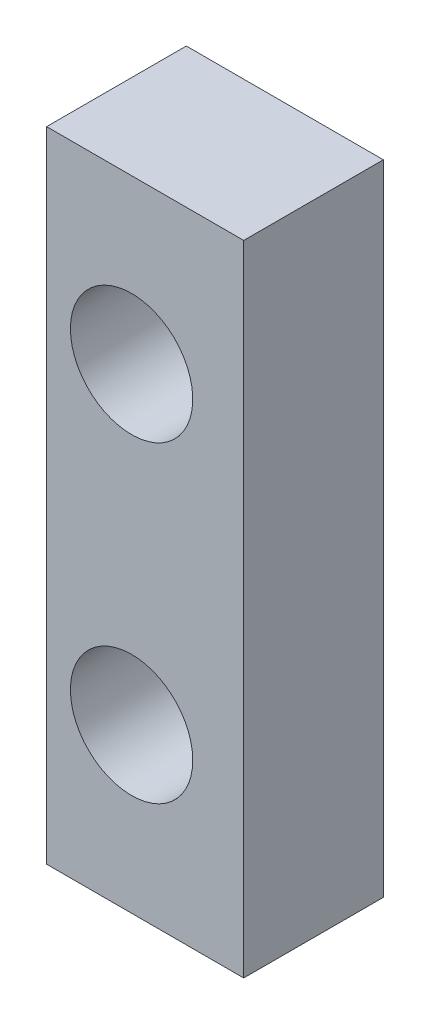
ISO-10303-21;
HEADER;
FILE_DESCRIPTION(('STEP AP214'),'2;1');
FILE_NAME('part.step','',(''),(''),'','','');
FILE_SCHEMA(('AUTOMOTIVE_DESIGN { 1 0 10303 214 1 1 1 1 }'));
ENDSEC;
DATA;
#1=APPLICATION_CONTEXT('core data for automotive mechanical design processes');
#2=APPLICATION_PROTOCOL_DEFINITION('international standard','automotive_design',2000,#1);
#3=PRODUCT_CONTEXT('',#1,'mechanical');
#4=PRODUCT('Part','Part','',(#3));
#5=PRODUCT_RELATED_PRODUCT_CATEGORY('part','',(#4));
#6=PRODUCT_DEFINITION_FORMATION('','',#4);
#7=PRODUCT_DEFINITION_CONTEXT('part definition',#1,'design');
#8=PRODUCT_DEFINITION('design','',#6,#7);
#9=PRODUCT_DEFINITION_SHAPE('','',#8);
#10=(LENGTH_UNIT() NAMED_UNIT(*) SI_UNIT(.MILLI.,.METRE.));
#11=(NAMED_UNIT(*) PLANE_ANGLE_UNIT() SI_UNIT($,.RADIAN.));
#12=(NAMED_UNIT(*) SI_UNIT($,.STERADIAN.) SOLID_ANGLE_UNIT());
#13=UNCERTAINTY_MEASURE_WITH_UNIT(LENGTH_MEASURE(1.E-05),#10,'distance_accuracy_value','');
#14=(GEOMETRIC_REPRESENTATION_CONTEXT(3) GLOBAL_UNCERTAINTY_ASSIGNED_CONTEXT((#13)) GLOBAL_UNIT_ASSIGNED_CONTEXT((#10,
#11,#12)) REPRESENTATION_CONTEXT('',''));
#15=CARTESIAN_POINT('',(0.,0.,0.));
#16=DIRECTION('',(0.,0.,1.));
#17=DIRECTION('',(1.,0.,0.));
#18=AXIS2_PLACEMENT_3D('',#15,#16,#17);
#19=CARTESIAN_POINT('',(0.,0.,2.));
#20=DIRECTION('',(0.,0.,1.));
#21=DIRECTION('',(1.,0.,0.));
#22=AXIS2_PLACEMENT_3D('',#19,#20,#21);
#23=PLANE('',#22);
#24=CARTESIAN_POINT('',(-76.4521460654272,-15.7054679044071,2.));
#25=DIRECTION('',(0.,0.,1.));
#26=DIRECTION('',(1.,0.,0.));
#27=AXIS2_PLACEMENT_3D('',#24,#25,#26);
#28=CIRCLE('',#27,0.875876913438823);
#29=CARTESIAN_POINT('',(-75.5762691519884,-15.7054679044071,2.));
#30=VERTEX_POINT('',#29);
#31=EDGE_CURVE('E108',#30,#30,#28,.T.);
#32=ORIENTED_EDGE('',*,*,#31,.F.);
#33=EDGE_LOOP('',(#32));
#34=FACE_BOUND('',#33,.T.);
#35=DIRECTION('',(1.,0.,0.));
#36=VECTOR('',#35,1.);
#37=CARTESIAN_POINT('',(-77.6686417784937,-18.0411396735773,2.));
#38=LINE('',#37,#36);
#39=CARTESIAN_POINT('',(-77.6686417784937,-18.0411396735773,2.));
#40=VERTEX_POINT('',#39);
#41=CARTESIAN_POINT('',(-74.8463717240987,-18.0411396735773,2.));
#42=VERTEX_POINT('',#41);
#43=EDGE_CURVE('E93',#40,#42,#38,.T.);
#44=ORIENTED_EDGE('',*,*,#43,.T.);
#45=DIRECTION('',(0.,1.,0.));
#46=VECTOR('',#45,1.);
#47=CARTESIAN_POINT('',(-74.8463717240987,-18.0411396735773,2.));
#48=LINE('',#47,#46);
#49=CARTESIAN_POINT('',(-74.8463717240987,-8.89309191099405,2.));
#50=VERTEX_POINT('',#49);
#51=EDGE_CURVE('E88',#42,#50,#48,.T.);
#52=ORIENTED_EDGE('',*,*,#51,.T.);
#53=DIRECTION('',(-1.,0.,0.));
#54=VECTOR('',#53,1.);
#55=CARTESIAN_POINT('',(-77.6686417784937,-8.89309191099405,2.));
#56=LINE('',#55,#54);
#57=CARTESIAN_POINT('',(-77.6686417784937,-8.89309191099405,2.));
#58=VERTEX_POINT('',#57);
#59=EDGE_CURVE('E91',#50,#58,#56,.T.);
#60=ORIENTED_EDGE('',*,*,#59,.T.);
#61=DIRECTION('',(0.,-1.,0.));
#62=VECTOR('',#61,1.);
#63=CARTESIAN_POINT('',(-77.6686417784937,-8.89309191099405,2.));
#64=LINE('',#63,#62);
#65=EDGE_CURVE('E58',#58,#40,#64,.T.);
#66=ORIENTED_EDGE('',*,*,#65,.T.);
#67=EDGE_LOOP('',(#44,#52,#60,#66));
#68=FACE_BOUND('',#67,.T.);
#69=CARTESIAN_POINT('',(-76.4521460654272,-11.2287636801643,2.));
#70=DIRECTION('',(0.,0.,1.));
#71=DIRECTION('',(-1.,0.,0.));
#72=AXIS2_PLACEMENT_3D('',#69,#70,#71);
#73=CIRCLE('',#72,0.875876913438823);
#74=CARTESIAN_POINT('',(-77.328022978866,-11.2287636801643,2.));
#75=VERTEX_POINT('',#74);
#76=EDGE_CURVE('E123',#75,#75,#73,.T.);
#77=ORIENTED_EDGE('',*,*,#76,.F.);
#78=EDGE_LOOP('',(#77));
#79=FACE_BOUND('',#78,.T.);
#80=ADVANCED_FACE('F41',(#34,#68,#79),#23,.T.);
#81=CARTESIAN_POINT('',(0.,0.,0.));
#82=DIRECTION('',(0.,0.,1.));
#83=DIRECTION('',(1.,0.,0.));
#84=AXIS2_PLACEMENT_3D('',#81,#82,#83);
#85=PLANE('',#84);
#86=DIRECTION('',(1.,0.,0.));
#87=VECTOR('',#86,1.);
#88=CARTESIAN_POINT('',(-77.6686417784937,-18.0411396735773,0.));
#89=LINE('',#88,#87);
#90=CARTESIAN_POINT('',(-77.6686417784937,-18.0411396735773,0.));
#91=VERTEX_POINT('',#90);
#92=CARTESIAN_POINT('',(-74.8463717240987,-18.0411396735773,0.));
#93=VERTEX_POINT('',#92);
#94=EDGE_CURVE('E105',#91,#93,#89,.T.);
#95=ORIENTED_EDGE('',*,*,#94,.F.);
#96=DIRECTION('',(0.,-1.,0.));
#97=VECTOR('',#96,1.);
#98=CARTESIAN_POINT('',(-77.6686417784937,-8.89309191099405,0.));
#99=LINE('',#98,#97);
#100=CARTESIAN_POINT('',(-77.6686417784937,-8.89309191099405,0.));
#101=VERTEX_POINT('',#100);
#102=EDGE_CURVE('E81',#101,#91,#99,.T.);
#103=ORIENTED_EDGE('',*,*,#102,.F.);
#104=DIRECTION('',(-1.,0.,0.));
#105=VECTOR('',#104,1.);
#106=CARTESIAN_POINT('',(-77.6686417784937,-8.89309191099405,0.));
#107=LINE('',#106,#105);
#108=CARTESIAN_POINT('',(-74.8463717240987,-8.89309191099405,0.));
#109=VERTEX_POINT('',#108);
#110=EDGE_CURVE('E75',#109,#101,#107,.T.);
#111=ORIENTED_EDGE('',*,*,#110,.F.);
#112=DIRECTION('',(0.,1.,0.));
#113=VECTOR('',#112,1.);
#114=CARTESIAN_POINT('',(-74.8463717240987,-18.0411396735773,0.));
#115=LINE('',#114,#113);
#116=EDGE_CURVE('E97',#93,#109,#115,.T.);
#117=ORIENTED_EDGE('',*,*,#116,.F.);
#118=EDGE_LOOP('',(#95,#103,#111,#117));
#119=FACE_BOUND('',#118,.T.);
#120=CARTESIAN_POINT('',(-76.4521460654272,-15.7054679044071,0.));
#121=DIRECTION('',(0.,0.,1.));
#122=DIRECTION('',(1.,0.,0.));
#123=AXIS2_PLACEMENT_3D('',#120,#121,#122);
#124=CIRCLE('',#123,0.875876913438823);
#125=CARTESIAN_POINT('',(-75.5762691519884,-15.7054679044071,0.));
#126=VERTEX_POINT('',#125);
#127=EDGE_CURVE('E120',#126,#126,#124,.T.);
#128=ORIENTED_EDGE('',*,*,#127,.T.);
#129=EDGE_LOOP('',(#128));
#130=FACE_BOUND('',#129,.T.);
#131=CARTESIAN_POINT('',(-76.4521460654272,-11.2287636801643,0.));
#132=DIRECTION('',(0.,0.,1.));
#133=DIRECTION('',(-1.,0.,0.));
#134=AXIS2_PLACEMENT_3D('',#131,#132,#133);
#135=CIRCLE('',#134,0.875876913438823);
#136=CARTESIAN_POINT('',(-77.328022978866,-11.2287636801643,0.));
#137=VERTEX_POINT('',#136);
#138=EDGE_CURVE('E126',#137,#137,#135,.T.);
#139=ORIENTED_EDGE('',*,*,#138,.T.);
#140=EDGE_LOOP('',(#139));
#141=FACE_BOUND('',#140,.T.);
#142=ADVANCED_FACE('F116',(#119,#130,#141),#85,.F.);
#143=CARTESIAN_POINT('',(-77.6686417784937,-18.0411396735773,2.));
#144=DIRECTION('',(0.,1.,0.));
#145=DIRECTION('',(0.,0.,1.));
#146=AXIS2_PLACEMENT_3D('',#143,#144,#145);
#147=PLANE('',#146);
#148=ORIENTED_EDGE('',*,*,#94,.T.);
#149=DIRECTION('',(0.,0.,-1.));
#150=VECTOR('',#149,1.);
#151=CARTESIAN_POINT('',(-74.8463717240987,-18.0411396735773,2.));
#152=LINE('',#151,#150);
#153=EDGE_CURVE('E11',#42,#93,#152,.T.);
#154=ORIENTED_EDGE('',*,*,#153,.F.);
#155=ORIENTED_EDGE('',*,*,#43,.F.);
#156=DIRECTION('',(0.,0.,-1.));
#157=VECTOR('',#156,1.);
#158=CARTESIAN_POINT('',(-77.6686417784937,-18.0411396735773,2.));
#159=LINE('',#158,#157);
#160=EDGE_CURVE('E101',#40,#91,#159,.T.);
#161=ORIENTED_EDGE('',*,*,#160,.T.);
#162=EDGE_LOOP('',(#148,#154,#155,#161));
#163=FACE_BOUND('',#162,.T.);
#164=ADVANCED_FACE('F43',(#163),#147,.F.);
#165=CARTESIAN_POINT('',(-74.8463717240987,-18.0411396735773,2.));
#166=DIRECTION('',(-1.,0.,0.));
#167=DIRECTION('',(0.,0.,1.));
#168=AXIS2_PLACEMENT_3D('',#165,#166,#167);
#169=PLANE('',#168);
#170=ORIENTED_EDGE('',*,*,#116,.T.);
#171=DIRECTION('',(0.,0.,-1.));
#172=VECTOR('',#171,1.);
#173=CARTESIAN_POINT('',(-74.8463717240987,-8.89309191099405,2.));
#174=LINE('',#173,#172);
#175=EDGE_CURVE('E50',#50,#109,#174,.T.);
#176=ORIENTED_EDGE('',*,*,#175,.F.);
#177=ORIENTED_EDGE('',*,*,#51,.F.);
#178=ORIENTED_EDGE('',*,*,#153,.T.);
#179=EDGE_LOOP('',(#170,#176,#177,#178));
#180=FACE_BOUND('',#179,.T.);
#181=ADVANCED_FACE('F96',(#180),#169,.F.);
#182=CARTESIAN_POINT('',(-77.6686417784937,-8.89309191099405,2.));
#183=DIRECTION('',(0.,-1.,0.));
#184=DIRECTION('',(0.,0.,-1.));
#185=AXIS2_PLACEMENT_3D('',#182,#183,#184);
#186=PLANE('',#185);
#187=ORIENTED_EDGE('',*,*,#110,.T.);
#188=DIRECTION('',(0.,0.,-1.));
#189=VECTOR('',#188,1.);
#190=CARTESIAN_POINT('',(-77.6686417784937,-8.89309191099405,2.));
#191=LINE('',#190,#189);
#192=EDGE_CURVE('E98',#58,#101,#191,.T.);
#193=ORIENTED_EDGE('',*,*,#192,.F.);
#194=ORIENTED_EDGE('',*,*,#59,.F.);
#195=ORIENTED_EDGE('',*,*,#175,.T.);
#196=EDGE_LOOP('',(#187,#193,#194,#195));
#197=FACE_BOUND('',#196,.T.);
#198=ADVANCED_FACE('F99',(#197),#186,.F.);
#199=CARTESIAN_POINT('',(-77.6686417784937,-8.89309191099405,2.));
#200=DIRECTION('',(1.,0.,0.));
#201=DIRECTION('',(0.,0.,-1.));
#202=AXIS2_PLACEMENT_3D('',#199,#200,#201);
#203=PLANE('',#202);
#204=ORIENTED_EDGE('',*,*,#102,.T.);
#205=ORIENTED_EDGE('',*,*,#160,.F.);
#206=ORIENTED_EDGE('',*,*,#65,.F.);
#207=ORIENTED_EDGE('',*,*,#192,.T.);
#208=EDGE_LOOP('',(#204,#205,#206,#207));
#209=FACE_BOUND('',#208,.T.);
#210=ADVANCED_FACE('F113',(#209),#203,.F.);
#211=CARTESIAN_POINT('',(-76.4521460654272,-15.7054679044071,2.));
#212=DIRECTION('',(0.,0.,-1.));
#213=DIRECTION('',(-1.,0.,0.));
#214=AXIS2_PLACEMENT_3D('',#211,#212,#213);
#215=CYLINDRICAL_SURFACE('',#214,0.875876913438823);
#216=ORIENTED_EDGE('',*,*,#31,.T.);
#217=EDGE_LOOP('',(#216));
#218=FACE_BOUND('',#217,.T.);
#219=ORIENTED_EDGE('',*,*,#127,.F.);
#220=EDGE_LOOP('',(#219));
#221=FACE_BOUND('',#220,.T.);
#222=ADVANCED_FACE('F143',(#218,#221),#215,.F.);
#223=CARTESIAN_POINT('',(-76.4521460654272,-11.2287636801643,2.));
#224=DIRECTION('',(0.,0.,-1.));
#225=DIRECTION('',(-1.,0.,0.));
#226=AXIS2_PLACEMENT_3D('',#223,#224,#225);
#227=CYLINDRICAL_SURFACE('',#226,0.875876913438823);
#228=ORIENTED_EDGE('',*,*,#76,.T.);
#229=EDGE_LOOP('',(#228));
#230=FACE_BOUND('',#229,.T.);
#231=ORIENTED_EDGE('',*,*,#138,.F.);
#232=EDGE_LOOP('',(#231));
#233=FACE_BOUND('',#232,.T.);
#234=ADVANCED_FACE('F132',(#230,#233),#227,.F.);
#235=CLOSED_SHELL('',(#80,#142,#164,#181,#198,#210,#222,#234));
#236=MANIFOLD_SOLID_BREP('B2',#235);
#237=ADVANCED_BREP_SHAPE_REPRESENTATION('',(#18,#236),#14);
#238=SHAPE_DEFINITION_REPRESENTATION(#9,#237);
ENDSEC;
END-ISO-10303-21;
